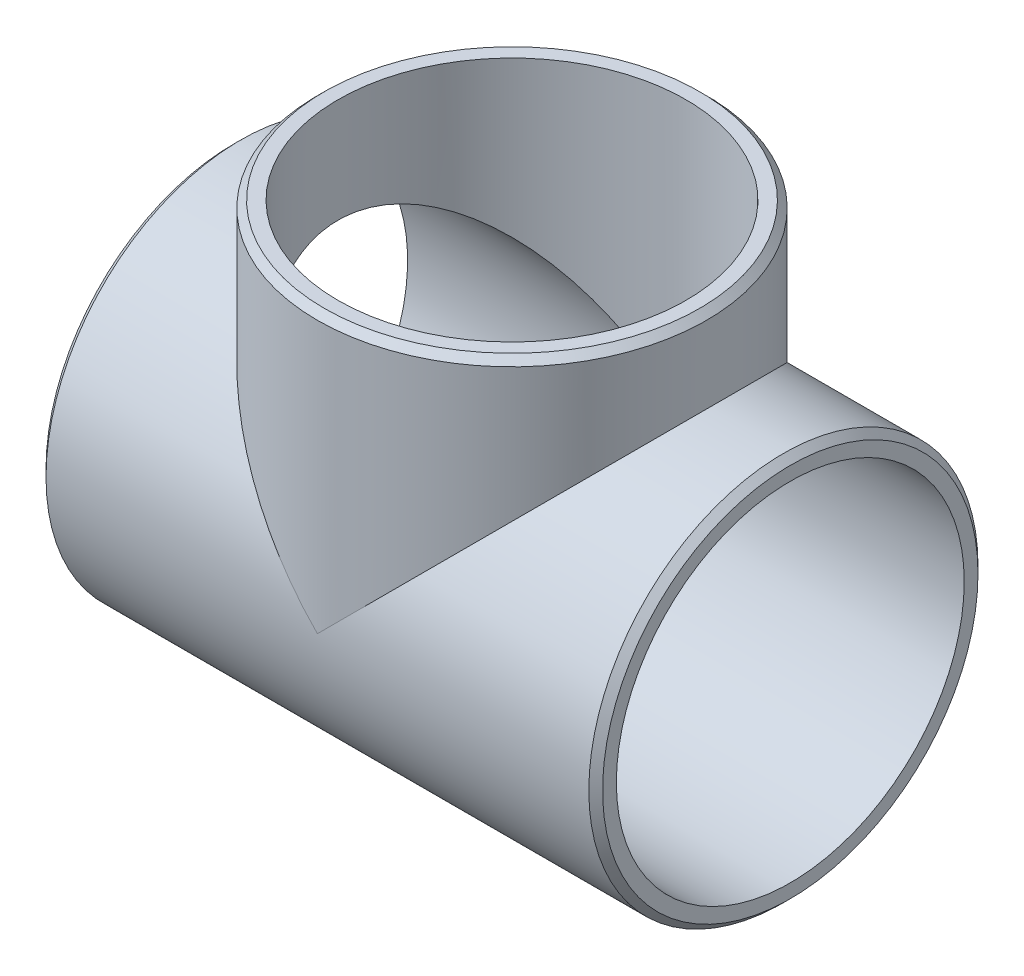
ISO-10303-21;
HEADER;
FILE_DESCRIPTION(('STEP AP214'),'2;1');
FILE_NAME('part.step','',(''),(''),'','','');
FILE_SCHEMA(('AUTOMOTIVE_DESIGN { 1 0 10303 214 1 1 1 1 }'));
ENDSEC;
DATA;
#1=APPLICATION_CONTEXT('core data for automotive mechanical design processes');
#2=APPLICATION_PROTOCOL_DEFINITION('international standard','automotive_design',2000,#1);
#3=PRODUCT_CONTEXT('',#1,'mechanical');
#4=PRODUCT('Part','Part','',(#3));
#5=PRODUCT_RELATED_PRODUCT_CATEGORY('part','',(#4));
#6=PRODUCT_DEFINITION_FORMATION('','',#4);
#7=PRODUCT_DEFINITION_CONTEXT('part definition',#1,'design');
#8=PRODUCT_DEFINITION('design','',#6,#7);
#9=PRODUCT_DEFINITION_SHAPE('','',#8);
#10=(LENGTH_UNIT() NAMED_UNIT(*) SI_UNIT(.MILLI.,.METRE.));
#11=(NAMED_UNIT(*) PLANE_ANGLE_UNIT() SI_UNIT($,.RADIAN.));
#12=(NAMED_UNIT(*) SI_UNIT($,.STERADIAN.) SOLID_ANGLE_UNIT());
#13=UNCERTAINTY_MEASURE_WITH_UNIT(LENGTH_MEASURE(1.E-05),#10,'distance_accuracy_value','');
#14=(GEOMETRIC_REPRESENTATION_CONTEXT(3) GLOBAL_UNCERTAINTY_ASSIGNED_CONTEXT((#13)) GLOBAL_UNIT_ASSIGNED_CONTEXT((#10,
#11,#12)) REPRESENTATION_CONTEXT('',''));
#15=CARTESIAN_POINT('',(0.,0.,0.));
#16=DIRECTION('',(0.,0.,1.));
#17=DIRECTION('',(1.,0.,0.));
#18=AXIS2_PLACEMENT_3D('',#15,#16,#17);
#19=CARTESIAN_POINT('',(-25.6,0.,0.));
#20=DIRECTION('',(-1.,0.,0.));
#21=DIRECTION('',(0.,0.,-1.));
#22=AXIS2_PLACEMENT_3D('',#19,#20,#21);
#23=PLANE('',#22);
#24=CARTESIAN_POINT('',(-25.6,0.,0.));
#25=DIRECTION('',(-1.,0.,0.));
#26=DIRECTION('',(0.,0.,1.));
#27=AXIS2_PLACEMENT_3D('',#24,#25,#26);
#28=CIRCLE('',#27,17.2666666666667);
#29=CARTESIAN_POINT('',(-25.6,0.,17.2666666666667));
#30=VERTEX_POINT('',#29);
#31=EDGE_CURVE('E42',#30,#30,#28,.T.);
#32=ORIENTED_EDGE('',*,*,#31,.T.);
#33=EDGE_LOOP('',(#32));
#34=FACE_BOUND('',#33,.T.);
#35=CARTESIAN_POINT('',(-25.6,0.,0.));
#36=DIRECTION('',(-1.,0.,0.));
#37=DIRECTION('',(0.,0.,1.));
#38=AXIS2_PLACEMENT_3D('',#35,#36,#37);
#39=CIRCLE('',#38,16.);
#40=CARTESIAN_POINT('',(-25.6,0.,16.));
#41=VERTEX_POINT('',#40);
#42=EDGE_CURVE('E69',#41,#41,#39,.F.);
#43=ORIENTED_EDGE('',*,*,#42,.T.);
#44=EDGE_LOOP('',(#43));
#45=FACE_BOUND('',#44,.T.);
#46=ADVANCED_FACE('F34',(#34,#45),#23,.T.);
#47=CARTESIAN_POINT('',(25.6,0.,0.));
#48=DIRECTION('',(-1.,0.,0.));
#49=DIRECTION('',(0.,0.,1.));
#50=AXIS2_PLACEMENT_3D('',#47,#48,#49);
#51=CYLINDRICAL_SURFACE('',#50,17.9);
#52=CARTESIAN_POINT('',(-24.9666666666667,0.,0.));
#53=DIRECTION('',(-1.,0.,0.));
#54=DIRECTION('',(0.,0.,1.));
#55=AXIS2_PLACEMENT_3D('',#52,#53,#54);
#56=CIRCLE('',#55,17.9);
#57=CARTESIAN_POINT('',(-24.9666666666667,0.,17.9));
#58=VERTEX_POINT('',#57);
#59=EDGE_CURVE('E88',#58,#58,#56,.F.);
#60=ORIENTED_EDGE('',*,*,#59,.T.);
#61=EDGE_LOOP('',(#60));
#62=FACE_BOUND('',#61,.T.);
#63=CARTESIAN_POINT('',(24.9666666666667,0.,0.));
#64=DIRECTION('',(1.,0.,0.));
#65=DIRECTION('',(0.,0.,-1.));
#66=AXIS2_PLACEMENT_3D('',#63,#64,#65);
#67=CIRCLE('',#66,17.9);
#68=CARTESIAN_POINT('',(24.9666666666667,0.,-17.9));
#69=VERTEX_POINT('',#68);
#70=EDGE_CURVE('E85',#69,#69,#67,.F.);
#71=ORIENTED_EDGE('',*,*,#70,.T.);
#72=EDGE_LOOP('',(#71));
#73=FACE_BOUND('',#72,.T.);
#74=CARTESIAN_POINT('',(0.,0.,0.));
#75=DIRECTION('',(-0.707106781186547,-0.707106781186547,0.));
#76=DIRECTION('',(-0.707106781186547,0.707106781186547,0.));
#77=AXIS2_PLACEMENT_3D('',#74,#75,#76);
#78=ELLIPSE('',#77,25.3144227664784,17.9);
#79=CARTESIAN_POINT('',(0.,0.,-17.9));
#80=VERTEX_POINT('',#79);
#81=CARTESIAN_POINT('',(0.,0.,17.9));
#82=VERTEX_POINT('',#81);
#83=EDGE_CURVE('E51',#80,#82,#78,.F.);
#84=ORIENTED_EDGE('',*,*,#83,.F.);
#85=CARTESIAN_POINT('',(0.,0.,0.));
#86=DIRECTION('',(-0.707106781186547,0.707106781186547,0.));
#87=DIRECTION('',(-0.707106781186547,-0.707106781186547,0.));
#88=AXIS2_PLACEMENT_3D('',#85,#86,#87);
#89=ELLIPSE('',#88,25.3144227664784,17.9);
#90=EDGE_CURVE('E48',#82,#80,#89,.T.);
#91=ORIENTED_EDGE('',*,*,#90,.F.);
#92=EDGE_LOOP('',(#84,#91));
#93=FACE_BOUND('',#92,.T.);
#94=ADVANCED_FACE('F101',(#62,#73,#93),#51,.T.);
#95=CARTESIAN_POINT('',(25.6,0.,0.));
#96=DIRECTION('',(1.,0.,0.));
#97=DIRECTION('',(0.,0.,-1.));
#98=AXIS2_PLACEMENT_3D('',#95,#96,#97);
#99=PLANE('',#98);
#100=CARTESIAN_POINT('',(25.6,0.,0.));
#101=DIRECTION('',(1.,0.,0.));
#102=DIRECTION('',(0.,0.,-1.));
#103=AXIS2_PLACEMENT_3D('',#100,#101,#102);
#104=CIRCLE('',#103,17.2666666666667);
#105=CARTESIAN_POINT('',(25.6,0.,-17.2666666666667));
#106=VERTEX_POINT('',#105);
#107=EDGE_CURVE('E11',#106,#106,#104,.T.);
#108=ORIENTED_EDGE('',*,*,#107,.T.);
#109=EDGE_LOOP('',(#108));
#110=FACE_BOUND('',#109,.T.);
#111=CARTESIAN_POINT('',(25.6,0.,0.));
#112=DIRECTION('',(1.,0.,0.));
#113=DIRECTION('',(0.,0.,-1.));
#114=AXIS2_PLACEMENT_3D('',#111,#112,#113);
#115=CIRCLE('',#114,16.);
#116=CARTESIAN_POINT('',(25.6,0.,-16.));
#117=VERTEX_POINT('',#116);
#118=EDGE_CURVE('E66',#117,#117,#115,.T.);
#119=ORIENTED_EDGE('',*,*,#118,.F.);
#120=EDGE_LOOP('',(#119));
#121=FACE_BOUND('',#120,.T.);
#122=ADVANCED_FACE('F104',(#110,#121),#99,.T.);
#123=CARTESIAN_POINT('',(0.,25.6,0.));
#124=DIRECTION('',(0.,-1.,0.));
#125=DIRECTION('',(0.,0.,-1.));
#126=AXIS2_PLACEMENT_3D('',#123,#124,#125);
#127=CYLINDRICAL_SURFACE('',#126,17.9);
#128=CARTESIAN_POINT('',(0.,24.9666666666667,0.));
#129=DIRECTION('',(0.,1.,0.));
#130=DIRECTION('',(0.,0.,1.));
#131=AXIS2_PLACEMENT_3D('',#128,#129,#130);
#132=CIRCLE('',#131,17.9);
#133=CARTESIAN_POINT('',(0.,24.9666666666667,17.9));
#134=VERTEX_POINT('',#133);
#135=EDGE_CURVE('E82',#134,#134,#132,.F.);
#136=ORIENTED_EDGE('',*,*,#135,.T.);
#137=EDGE_LOOP('',(#136));
#138=FACE_BOUND('',#137,.T.);
#139=ORIENTED_EDGE('',*,*,#90,.T.);
#140=ORIENTED_EDGE('',*,*,#83,.T.);
#141=EDGE_LOOP('',(#139,#140));
#142=FACE_BOUND('',#141,.T.);
#143=ADVANCED_FACE('F114',(#138,#142),#127,.T.);
#144=CARTESIAN_POINT('',(0.,25.6,0.));
#145=DIRECTION('',(0.,1.,0.));
#146=DIRECTION('',(0.,0.,1.));
#147=AXIS2_PLACEMENT_3D('',#144,#145,#146);
#148=PLANE('',#147);
#149=CARTESIAN_POINT('',(0.,25.6,0.));
#150=DIRECTION('',(0.,1.,0.));
#151=DIRECTION('',(0.,0.,1.));
#152=AXIS2_PLACEMENT_3D('',#149,#150,#151);
#153=CIRCLE('',#152,17.2666666666667);
#154=CARTESIAN_POINT('',(0.,25.6,17.2666666666667));
#155=VERTEX_POINT('',#154);
#156=EDGE_CURVE('E79',#155,#155,#153,.T.);
#157=ORIENTED_EDGE('',*,*,#156,.T.);
#158=EDGE_LOOP('',(#157));
#159=FACE_BOUND('',#158,.T.);
#160=CARTESIAN_POINT('',(0.,25.6,0.));
#161=DIRECTION('',(0.,1.,0.));
#162=DIRECTION('',(0.,0.,1.));
#163=AXIS2_PLACEMENT_3D('',#160,#161,#162);
#164=CIRCLE('',#163,16.);
#165=CARTESIAN_POINT('',(0.,25.6,16.));
#166=VERTEX_POINT('',#165);
#167=EDGE_CURVE('E73',#166,#166,#164,.T.);
#168=ORIENTED_EDGE('',*,*,#167,.F.);
#169=EDGE_LOOP('',(#168));
#170=FACE_BOUND('',#169,.T.);
#171=ADVANCED_FACE('F119',(#159,#170),#148,.T.);
#172=CARTESIAN_POINT('',(25.6,0.,0.));
#173=DIRECTION('',(-1.,0.,0.));
#174=DIRECTION('',(0.,0.,1.));
#175=AXIS2_PLACEMENT_3D('',#172,#173,#174);
#176=CYLINDRICAL_SURFACE('',#175,16.);
#177=ORIENTED_EDGE('',*,*,#42,.F.);
#178=EDGE_LOOP('',(#177));
#179=FACE_BOUND('',#178,.T.);
#180=ORIENTED_EDGE('',*,*,#118,.T.);
#181=EDGE_LOOP('',(#180));
#182=FACE_BOUND('',#181,.T.);
#183=CARTESIAN_POINT('',(0.,0.,0.));
#184=DIRECTION('',(-0.707106781186547,-0.707106781186547,0.));
#185=DIRECTION('',(-0.707106781186547,0.707106781186547,0.));
#186=AXIS2_PLACEMENT_3D('',#183,#184,#185);
#187=ELLIPSE('',#186,22.6274169979695,16.);
#188=CARTESIAN_POINT('',(0.,0.,-16.));
#189=VERTEX_POINT('',#188);
#190=CARTESIAN_POINT('',(0.,0.,16.));
#191=VERTEX_POINT('',#190);
#192=EDGE_CURVE('E59',#189,#191,#187,.F.);
#193=ORIENTED_EDGE('',*,*,#192,.T.);
#194=CARTESIAN_POINT('',(0.,0.,0.));
#195=DIRECTION('',(-0.707106781186547,0.707106781186547,0.));
#196=DIRECTION('',(-0.707106781186547,-0.707106781186547,0.));
#197=AXIS2_PLACEMENT_3D('',#194,#195,#196);
#198=ELLIPSE('',#197,22.6274169979695,16.);
#199=EDGE_CURVE('E62',#191,#189,#198,.T.);
#200=ORIENTED_EDGE('',*,*,#199,.T.);
#201=EDGE_LOOP('',(#193,#200));
#202=FACE_BOUND('',#201,.T.);
#203=ADVANCED_FACE('F65',(#179,#182,#202),#176,.F.);
#204=CARTESIAN_POINT('',(0.,25.6,0.));
#205=DIRECTION('',(0.,-1.,0.));
#206=DIRECTION('',(0.,0.,-1.));
#207=AXIS2_PLACEMENT_3D('',#204,#205,#206);
#208=CYLINDRICAL_SURFACE('',#207,16.);
#209=ORIENTED_EDGE('',*,*,#167,.T.);
#210=EDGE_LOOP('',(#209));
#211=FACE_BOUND('',#210,.T.);
#212=ORIENTED_EDGE('',*,*,#199,.F.);
#213=ORIENTED_EDGE('',*,*,#192,.F.);
#214=EDGE_LOOP('',(#212,#213));
#215=FACE_BOUND('',#214,.T.);
#216=ADVANCED_FACE('F61',(#211,#215),#208,.F.);
#217=CARTESIAN_POINT('',(0.,25.6,0.));
#218=DIRECTION('',(0.,-1.,0.));
#219=DIRECTION('',(0.,0.,-1.));
#220=AXIS2_PLACEMENT_3D('',#217,#218,#219);
#221=CONICAL_SURFACE('',#220,17.2666666666667,0.785398163397454);
#222=ORIENTED_EDGE('',*,*,#135,.F.);
#223=EDGE_LOOP('',(#222));
#224=FACE_BOUND('',#223,.T.);
#225=ORIENTED_EDGE('',*,*,#156,.F.);
#226=EDGE_LOOP('',(#225));
#227=FACE_BOUND('',#226,.T.);
#228=ADVANCED_FACE('F98',(#224,#227),#221,.T.);
#229=CARTESIAN_POINT('',(-24.9666666666667,0.,0.));
#230=DIRECTION('',(1.,0.,0.));
#231=DIRECTION('',(0.,0.,-1.));
#232=AXIS2_PLACEMENT_3D('',#229,#230,#231);
#233=CONICAL_SURFACE('',#232,17.9,0.785398163397451);
#234=ORIENTED_EDGE('',*,*,#31,.F.);
#235=EDGE_LOOP('',(#234));
#236=FACE_BOUND('',#235,.T.);
#237=ORIENTED_EDGE('',*,*,#59,.F.);
#238=EDGE_LOOP('',(#237));
#239=FACE_BOUND('',#238,.T.);
#240=ADVANCED_FACE('F95',(#236,#239),#233,.T.);
#241=CARTESIAN_POINT('',(25.6,0.,0.));
#242=DIRECTION('',(-1.,0.,0.));
#243=DIRECTION('',(0.,0.,1.));
#244=AXIS2_PLACEMENT_3D('',#241,#242,#243);
#245=CONICAL_SURFACE('',#244,17.2666666666667,0.785398163397454);
#246=ORIENTED_EDGE('',*,*,#70,.F.);
#247=EDGE_LOOP('',(#246));
#248=FACE_BOUND('',#247,.T.);
#249=ORIENTED_EDGE('',*,*,#107,.F.);
#250=EDGE_LOOP('',(#249));
#251=FACE_BOUND('',#250,.T.);
#252=ADVANCED_FACE('F36',(#248,#251),#245,.T.);
#253=CLOSED_SHELL('',(#46,#94,#122,#143,#171,#203,#216,#228,#240,#252));
#254=MANIFOLD_SOLID_BREP('B2',#253);
#255=ADVANCED_BREP_SHAPE_REPRESENTATION('',(#18,#254),#14);
#256=SHAPE_DEFINITION_REPRESENTATION(#9,#255);
ENDSEC;
END-ISO-10303-21;
